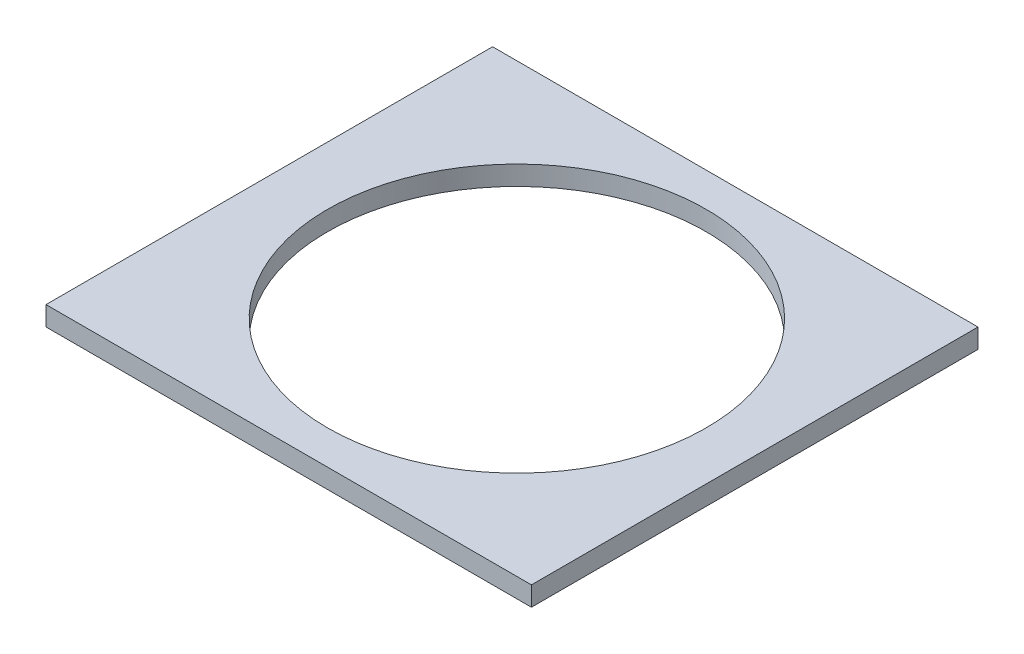
ISO-10303-21;
HEADER;
FILE_DESCRIPTION(('STEP AP214'),'2;1');
FILE_NAME('part.step','',(''),(''),'','','');
FILE_SCHEMA(('AUTOMOTIVE_DESIGN { 1 0 10303 214 1 1 1 1 }'));
ENDSEC;
DATA;
#1=APPLICATION_CONTEXT('core data for automotive mechanical design processes');
#2=APPLICATION_PROTOCOL_DEFINITION('international standard','automotive_design',2000,#1);
#3=PRODUCT_CONTEXT('',#1,'mechanical');
#4=PRODUCT('Part','Part','',(#3));
#5=PRODUCT_RELATED_PRODUCT_CATEGORY('part','',(#4));
#6=PRODUCT_DEFINITION_FORMATION('','',#4);
#7=PRODUCT_DEFINITION_CONTEXT('part definition',#1,'design');
#8=PRODUCT_DEFINITION('design','',#6,#7);
#9=PRODUCT_DEFINITION_SHAPE('','',#8);
#10=(LENGTH_UNIT() NAMED_UNIT(*) SI_UNIT(.MILLI.,.METRE.));
#11=(NAMED_UNIT(*) PLANE_ANGLE_UNIT() SI_UNIT($,.RADIAN.));
#12=(NAMED_UNIT(*) SI_UNIT($,.STERADIAN.) SOLID_ANGLE_UNIT());
#13=UNCERTAINTY_MEASURE_WITH_UNIT(LENGTH_MEASURE(1.E-05),#10,'distance_accuracy_value','');
#14=(GEOMETRIC_REPRESENTATION_CONTEXT(3) GLOBAL_UNCERTAINTY_ASSIGNED_CONTEXT((#13)) GLOBAL_UNIT_ASSIGNED_CONTEXT((#10,
#11,#12)) REPRESENTATION_CONTEXT('',''));
#15=CARTESIAN_POINT('',(0.,0.,0.));
#16=DIRECTION('',(0.,0.,1.));
#17=DIRECTION('',(1.,0.,0.));
#18=AXIS2_PLACEMENT_3D('',#15,#16,#17);
#19=CARTESIAN_POINT('',(-12.5,13.,11.5));
#20=DIRECTION('',(1.,0.,0.));
#21=DIRECTION('',(0.,0.,-1.));
#22=AXIS2_PLACEMENT_3D('',#19,#20,#21);
#23=PLANE('',#22);
#24=DIRECTION('',(0.,0.,1.));
#25=VECTOR('',#24,1.);
#26=CARTESIAN_POINT('',(-12.5,12.,11.5));
#27=LINE('',#26,#25);
#28=CARTESIAN_POINT('',(-12.5,12.,-11.5));
#29=VERTEX_POINT('',#28);
#30=CARTESIAN_POINT('',(-12.5,12.,11.5));
#31=VERTEX_POINT('',#30);
#32=EDGE_CURVE('E96',#29,#31,#27,.T.);
#33=ORIENTED_EDGE('',*,*,#32,.T.);
#34=DIRECTION('',(0.,-1.,0.));
#35=VECTOR('',#34,1.);
#36=CARTESIAN_POINT('',(-12.5,13.,11.5));
#37=LINE('',#36,#35);
#38=CARTESIAN_POINT('',(-12.5,13.,11.5));
#39=VERTEX_POINT('',#38);
#40=EDGE_CURVE('E11',#39,#31,#37,.T.);
#41=ORIENTED_EDGE('',*,*,#40,.F.);
#42=DIRECTION('',(0.,0.,1.));
#43=VECTOR('',#42,1.);
#44=CARTESIAN_POINT('',(-12.5,13.,11.5));
#45=LINE('',#44,#43);
#46=CARTESIAN_POINT('',(-12.5,13.,-11.5));
#47=VERTEX_POINT('',#46);
#48=EDGE_CURVE('E84',#47,#39,#45,.T.);
#49=ORIENTED_EDGE('',*,*,#48,.F.);
#50=DIRECTION('',(0.,-1.,0.));
#51=VECTOR('',#50,1.);
#52=CARTESIAN_POINT('',(-12.5,13.,-11.5));
#53=LINE('',#52,#51);
#54=EDGE_CURVE('E92',#47,#29,#53,.T.);
#55=ORIENTED_EDGE('',*,*,#54,.T.);
#56=EDGE_LOOP('',(#33,#41,#49,#55));
#57=FACE_BOUND('',#56,.T.);
#58=ADVANCED_FACE('F33',(#57),#23,.F.);
#59=CARTESIAN_POINT('',(12.5,13.,11.5));
#60=DIRECTION('',(0.,0.,-1.));
#61=DIRECTION('',(-1.,0.,0.));
#62=AXIS2_PLACEMENT_3D('',#59,#60,#61);
#63=PLANE('',#62);
#64=DIRECTION('',(1.,0.,0.));
#65=VECTOR('',#64,1.);
#66=CARTESIAN_POINT('',(12.5,12.,11.5));
#67=LINE('',#66,#65);
#68=CARTESIAN_POINT('',(12.5,12.,11.5));
#69=VERTEX_POINT('',#68);
#70=EDGE_CURVE('E88',#31,#69,#67,.T.);
#71=ORIENTED_EDGE('',*,*,#70,.T.);
#72=DIRECTION('',(0.,-1.,0.));
#73=VECTOR('',#72,1.);
#74=CARTESIAN_POINT('',(12.5,13.,11.5));
#75=LINE('',#74,#73);
#76=CARTESIAN_POINT('',(12.5,13.,11.5));
#77=VERTEX_POINT('',#76);
#78=EDGE_CURVE('E41',#77,#69,#75,.T.);
#79=ORIENTED_EDGE('',*,*,#78,.F.);
#80=DIRECTION('',(1.,0.,0.));
#81=VECTOR('',#80,1.);
#82=CARTESIAN_POINT('',(12.5,13.,11.5));
#83=LINE('',#82,#81);
#84=EDGE_CURVE('E79',#39,#77,#83,.T.);
#85=ORIENTED_EDGE('',*,*,#84,.F.);
#86=ORIENTED_EDGE('',*,*,#40,.T.);
#87=EDGE_LOOP('',(#71,#79,#85,#86));
#88=FACE_BOUND('',#87,.T.);
#89=ADVANCED_FACE('F87',(#88),#63,.F.);
#90=CARTESIAN_POINT('',(12.5,13.,11.5));
#91=DIRECTION('',(-1.,0.,0.));
#92=DIRECTION('',(0.,0.,1.));
#93=AXIS2_PLACEMENT_3D('',#90,#91,#92);
#94=PLANE('',#93);
#95=DIRECTION('',(0.,0.,-1.));
#96=VECTOR('',#95,1.);
#97=CARTESIAN_POINT('',(12.5,12.,11.5));
#98=LINE('',#97,#96);
#99=CARTESIAN_POINT('',(12.5,12.,-11.5));
#100=VERTEX_POINT('',#99);
#101=EDGE_CURVE('E66',#69,#100,#98,.T.);
#102=ORIENTED_EDGE('',*,*,#101,.T.);
#103=DIRECTION('',(0.,-1.,0.));
#104=VECTOR('',#103,1.);
#105=CARTESIAN_POINT('',(12.5,13.,-11.5));
#106=LINE('',#105,#104);
#107=CARTESIAN_POINT('',(12.5,13.,-11.5));
#108=VERTEX_POINT('',#107);
#109=EDGE_CURVE('E89',#108,#100,#106,.T.);
#110=ORIENTED_EDGE('',*,*,#109,.F.);
#111=DIRECTION('',(0.,0.,-1.));
#112=VECTOR('',#111,1.);
#113=CARTESIAN_POINT('',(12.5,13.,11.5));
#114=LINE('',#113,#112);
#115=EDGE_CURVE('E82',#77,#108,#114,.T.);
#116=ORIENTED_EDGE('',*,*,#115,.F.);
#117=ORIENTED_EDGE('',*,*,#78,.T.);
#118=EDGE_LOOP('',(#102,#110,#116,#117));
#119=FACE_BOUND('',#118,.T.);
#120=ADVANCED_FACE('F90',(#119),#94,.F.);
#121=CARTESIAN_POINT('',(12.5,13.,-11.5));
#122=DIRECTION('',(0.,0.,1.));
#123=DIRECTION('',(1.,0.,0.));
#124=AXIS2_PLACEMENT_3D('',#121,#122,#123);
#125=PLANE('',#124);
#126=DIRECTION('',(-1.,0.,0.));
#127=VECTOR('',#126,1.);
#128=CARTESIAN_POINT('',(12.5,12.,-11.5));
#129=LINE('',#128,#127);
#130=EDGE_CURVE('E72',#100,#29,#129,.T.);
#131=ORIENTED_EDGE('',*,*,#130,.T.);
#132=ORIENTED_EDGE('',*,*,#54,.F.);
#133=DIRECTION('',(-1.,0.,0.));
#134=VECTOR('',#133,1.);
#135=CARTESIAN_POINT('',(12.5,13.,-11.5));
#136=LINE('',#135,#134);
#137=EDGE_CURVE('E49',#108,#47,#136,.T.);
#138=ORIENTED_EDGE('',*,*,#137,.F.);
#139=ORIENTED_EDGE('',*,*,#109,.T.);
#140=EDGE_LOOP('',(#131,#132,#138,#139));
#141=FACE_BOUND('',#140,.T.);
#142=ADVANCED_FACE('F104',(#141),#125,.F.);
#143=CARTESIAN_POINT('',(0.,13.,0.));
#144=DIRECTION('',(0.,1.,0.));
#145=DIRECTION('',(0.,0.,1.));
#146=AXIS2_PLACEMENT_3D('',#143,#144,#145);
#147=PLANE('',#146);
#148=CARTESIAN_POINT('',(0.249999999999999,13.,0.));
#149=DIRECTION('',(0.,1.,0.));
#150=DIRECTION('',(0.,0.,1.));
#151=AXIS2_PLACEMENT_3D('',#148,#149,#150);
#152=CIRCLE('',#151,9.75);
#153=CARTESIAN_POINT('',(0.249999999999999,13.,9.75));
#154=VERTEX_POINT('',#153);
#155=EDGE_CURVE('E110',#154,#154,#152,.T.);
#156=ORIENTED_EDGE('',*,*,#155,.F.);
#157=EDGE_LOOP('',(#156));
#158=FACE_BOUND('',#157,.T.);
#159=ORIENTED_EDGE('',*,*,#48,.T.);
#160=ORIENTED_EDGE('',*,*,#84,.T.);
#161=ORIENTED_EDGE('',*,*,#115,.T.);
#162=ORIENTED_EDGE('',*,*,#137,.T.);
#163=EDGE_LOOP('',(#159,#160,#161,#162));
#164=FACE_BOUND('',#163,.T.);
#165=ADVANCED_FACE('F80',(#158,#164),#147,.T.);
#166=CARTESIAN_POINT('',(0.,12.,0.));
#167=DIRECTION('',(0.,1.,0.));
#168=DIRECTION('',(0.,0.,1.));
#169=AXIS2_PLACEMENT_3D('',#166,#167,#168);
#170=PLANE('',#169);
#171=CARTESIAN_POINT('',(0.249999999999999,12.,0.));
#172=DIRECTION('',(0.,1.,0.));
#173=DIRECTION('',(0.,0.,1.));
#174=AXIS2_PLACEMENT_3D('',#171,#172,#173);
#175=CIRCLE('',#174,9.75);
#176=CARTESIAN_POINT('',(0.249999999999999,12.,9.75));
#177=VERTEX_POINT('',#176);
#178=EDGE_CURVE('E99',#177,#177,#175,.T.);
#179=ORIENTED_EDGE('',*,*,#178,.T.);
#180=EDGE_LOOP('',(#179));
#181=FACE_BOUND('',#180,.T.);
#182=ORIENTED_EDGE('',*,*,#32,.F.);
#183=ORIENTED_EDGE('',*,*,#130,.F.);
#184=ORIENTED_EDGE('',*,*,#101,.F.);
#185=ORIENTED_EDGE('',*,*,#70,.F.);
#186=EDGE_LOOP('',(#182,#183,#184,#185));
#187=FACE_BOUND('',#186,.T.);
#188=ADVANCED_FACE('F107',(#181,#187),#170,.F.);
#189=CARTESIAN_POINT('',(0.249999999999999,12.,0.));
#190=DIRECTION('',(0.,1.,0.));
#191=DIRECTION('',(0.,0.,1.));
#192=AXIS2_PLACEMENT_3D('',#189,#190,#191);
#193=CYLINDRICAL_SURFACE('',#192,9.75);
#194=ORIENTED_EDGE('',*,*,#178,.F.);
#195=EDGE_LOOP('',(#194));
#196=FACE_BOUND('',#195,.T.);
#197=ORIENTED_EDGE('',*,*,#155,.T.);
#198=EDGE_LOOP('',(#197));
#199=FACE_BOUND('',#198,.T.);
#200=ADVANCED_FACE('F117',(#196,#199),#193,.F.);
#201=CLOSED_SHELL('',(#58,#89,#120,#142,#165,#188,#200));
#202=MANIFOLD_SOLID_BREP('B2',#201);
#203=ADVANCED_BREP_SHAPE_REPRESENTATION('',(#18,#202),#14);
#204=SHAPE_DEFINITION_REPRESENTATION(#9,#203);
ENDSEC;
END-ISO-10303-21;
